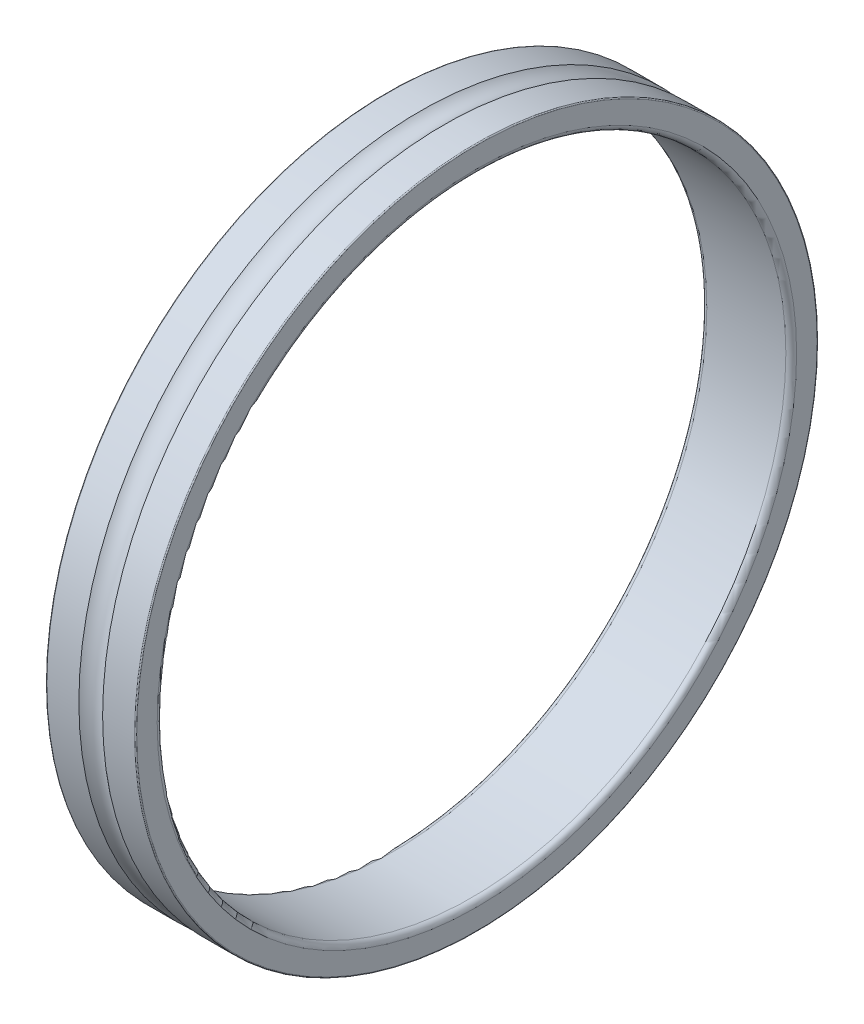
ISO-10303-21;
HEADER;
FILE_DESCRIPTION(('STEP AP214'),'2;1');
FILE_NAME('part.step','',(''),(''),'','','');
FILE_SCHEMA(('AUTOMOTIVE_DESIGN { 1 0 10303 214 1 1 1 1 }'));
ENDSEC;
DATA;
#1=APPLICATION_CONTEXT('core data for automotive mechanical design processes');
#2=APPLICATION_PROTOCOL_DEFINITION('international standard','automotive_design',2000,#1);
#3=PRODUCT_CONTEXT('',#1,'mechanical');
#4=PRODUCT('Part','Part','',(#3));
#5=PRODUCT_RELATED_PRODUCT_CATEGORY('part','',(#4));
#6=PRODUCT_DEFINITION_FORMATION('','',#4);
#7=PRODUCT_DEFINITION_CONTEXT('part definition',#1,'design');
#8=PRODUCT_DEFINITION('design','',#6,#7);
#9=PRODUCT_DEFINITION_SHAPE('','',#8);
#10=(LENGTH_UNIT() NAMED_UNIT(*) SI_UNIT(.MILLI.,.METRE.));
#11=(NAMED_UNIT(*) PLANE_ANGLE_UNIT() SI_UNIT($,.RADIAN.));
#12=(NAMED_UNIT(*) SI_UNIT($,.STERADIAN.) SOLID_ANGLE_UNIT());
#13=UNCERTAINTY_MEASURE_WITH_UNIT(LENGTH_MEASURE(1.E-05),#10,'distance_accuracy_value','');
#14=(GEOMETRIC_REPRESENTATION_CONTEXT(3) GLOBAL_UNCERTAINTY_ASSIGNED_CONTEXT((#13)) GLOBAL_UNIT_ASSIGNED_CONTEXT((#10,
#11,#12)) REPRESENTATION_CONTEXT('',''));
#15=CARTESIAN_POINT('',(0.,0.,0.));
#16=DIRECTION('',(0.,0.,1.));
#17=DIRECTION('',(1.,0.,0.));
#18=AXIS2_PLACEMENT_3D('',#15,#16,#17);
#19=CARTESIAN_POINT('',(0.,-19.2918359504884,-18.94));
#20=DIRECTION('',(-1.,0.,0.));
#21=DIRECTION('',(0.,0.,1.));
#22=AXIS2_PLACEMENT_3D('',#19,#20,#21);
#23=PLANE('',#22);
#24=CARTESIAN_POINT('',(0.,0.,0.));
#25=DIRECTION('',(-1.,0.,0.));
#26=DIRECTION('',(0.,0.,-1.));
#27=AXIS2_PLACEMENT_3D('',#24,#25,#26);
#28=CIRCLE('',#27,18.9400000048967);
#29=CARTESIAN_POINT('',(0.,0.,-18.9400000048967));
#30=VERTEX_POINT('',#29);
#31=EDGE_CURVE('E50',#30,#30,#28,.F.);
#32=ORIENTED_EDGE('',*,*,#31,.F.);
#33=EDGE_LOOP('',(#32));
#34=FACE_BOUND('',#33,.T.);
#35=CARTESIAN_POINT('',(0.,0.,0.));
#36=DIRECTION('',(1.,0.,0.));
#37=DIRECTION('',(0.,0.,1.));
#38=AXIS2_PLACEMENT_3D('',#35,#36,#37);
#39=CIRCLE('',#38,17.8);
#40=CARTESIAN_POINT('',(0.,0.,17.8));
#41=VERTEX_POINT('',#40);
#42=EDGE_CURVE('E47',#41,#41,#39,.T.);
#43=ORIENTED_EDGE('',*,*,#42,.T.);
#44=EDGE_LOOP('',(#43));
#45=FACE_BOUND('',#44,.T.);
#46=ADVANCED_FACE('F15',(#34,#45),#23,.T.);
#47=CARTESIAN_POINT('',(5.,-19.2918359175409,18.94));
#48=DIRECTION('',(1.,0.,0.));
#49=DIRECTION('',(0.,0.,-1.));
#50=AXIS2_PLACEMENT_3D('',#47,#48,#49);
#51=PLANE('',#50);
#52=CARTESIAN_POINT('',(5.,0.,0.));
#53=DIRECTION('',(1.,0.,0.));
#54=DIRECTION('',(0.,-1.16835753790261E-09,1.));
#55=AXIS2_PLACEMENT_3D('',#52,#53,#54);
#56=CIRCLE('',#55,18.94);
#57=CARTESIAN_POINT('',(5.,-2.21286917678754E-08,18.94));
#58=VERTEX_POINT('',#57);
#59=EDGE_CURVE('E44',#58,#58,#56,.T.);
#60=ORIENTED_EDGE('',*,*,#59,.T.);
#61=EDGE_LOOP('',(#60));
#62=FACE_BOUND('',#61,.T.);
#63=CARTESIAN_POINT('',(5.,0.,0.));
#64=DIRECTION('',(-1.,0.,0.));
#65=DIRECTION('',(0.,0.,-1.));
#66=AXIS2_PLACEMENT_3D('',#63,#64,#65);
#67=CIRCLE('',#66,17.8);
#68=CARTESIAN_POINT('',(5.,0.,-17.8));
#69=VERTEX_POINT('',#68);
#70=EDGE_CURVE('E41',#69,#69,#67,.F.);
#71=ORIENTED_EDGE('',*,*,#70,.F.);
#72=EDGE_LOOP('',(#71));
#73=FACE_BOUND('',#72,.T.);
#74=ADVANCED_FACE('F59',(#62,#73),#51,.T.);
#75=CARTESIAN_POINT('',(0.060000000000327,0.,0.));
#76=DIRECTION('',(1.,0.,0.));
#77=DIRECTION('',(0.,1.92337379696791E-10,1.));
#78=AXIS2_PLACEMENT_3D('',#75,#76,#77);
#79=TOROIDAL_SURFACE('',#78,18.9399999999997,0.0600000000003272);
#80=ORIENTED_EDGE('',*,*,#31,.T.);
#81=EDGE_LOOP('',(#80));
#82=FACE_BOUND('',#81,.T.);
#83=CARTESIAN_POINT('',(0.060000000000327,0.,0.));
#84=DIRECTION('',(-1.,0.,0.));
#85=DIRECTION('',(0.,0.,-1.));
#86=AXIS2_PLACEMENT_3D('',#83,#84,#85);
#87=CIRCLE('',#86,19.);
#88=CARTESIAN_POINT('',(0.060000000000327,0.,-19.));
#89=VERTEX_POINT('',#88);
#90=EDGE_CURVE('E38',#89,#89,#87,.F.);
#91=ORIENTED_EDGE('',*,*,#90,.F.);
#92=EDGE_LOOP('',(#91));
#93=FACE_BOUND('',#92,.T.);
#94=ADVANCED_FACE('F54',(#82,#93),#79,.T.);
#95=CARTESIAN_POINT('',(0.29999999999994,0.,0.));
#96=DIRECTION('',(1.,0.,0.));
#97=DIRECTION('',(0.,0.,1.));
#98=AXIS2_PLACEMENT_3D('',#95,#96,#97);
#99=TOROIDAL_SURFACE('',#98,17.8,0.29999999999994);
#100=CARTESIAN_POINT('',(0.3,0.,0.));
#101=DIRECTION('',(1.,0.,0.));
#102=DIRECTION('',(0.,0.,1.));
#103=AXIS2_PLACEMENT_3D('',#100,#101,#102);
#104=CIRCLE('',#103,17.5000000000001);
#105=CARTESIAN_POINT('',(0.3,0.,17.5000000000001));
#106=VERTEX_POINT('',#105);
#107=EDGE_CURVE('E35',#106,#106,#104,.T.);
#108=ORIENTED_EDGE('',*,*,#107,.T.);
#109=EDGE_LOOP('',(#108));
#110=FACE_BOUND('',#109,.T.);
#111=ORIENTED_EDGE('',*,*,#42,.F.);
#112=EDGE_LOOP('',(#111));
#113=FACE_BOUND('',#112,.T.);
#114=ADVANCED_FACE('F63',(#110,#113),#99,.T.);
#115=CARTESIAN_POINT('',(50.,0.,0.));
#116=DIRECTION('',(1.,0.,0.));
#117=DIRECTION('',(0.,0.,1.));
#118=AXIS2_PLACEMENT_3D('',#115,#116,#117);
#119=CYLINDRICAL_SURFACE('',#118,17.5);
#120=CARTESIAN_POINT('',(4.7,0.,0.));
#121=DIRECTION('',(1.,0.,0.));
#122=DIRECTION('',(0.,0.,1.));
#123=AXIS2_PLACEMENT_3D('',#120,#121,#122);
#124=CIRCLE('',#123,17.5);
#125=CARTESIAN_POINT('',(4.7,0.,17.5));
#126=VERTEX_POINT('',#125);
#127=EDGE_CURVE('E30',#126,#126,#124,.T.);
#128=ORIENTED_EDGE('',*,*,#127,.T.);
#129=EDGE_LOOP('',(#128));
#130=FACE_BOUND('',#129,.T.);
#131=ORIENTED_EDGE('',*,*,#107,.F.);
#132=EDGE_LOOP('',(#131));
#133=FACE_BOUND('',#132,.T.);
#134=ADVANCED_FACE('F65',(#130,#133),#119,.F.);
#135=CARTESIAN_POINT('',(4.70000000000012,0.,0.));
#136=DIRECTION('',(1.,0.,0.));
#137=DIRECTION('',(0.,0.,1.));
#138=AXIS2_PLACEMENT_3D('',#135,#136,#137);
#139=TOROIDAL_SURFACE('',#138,17.8,0.299999999999877);
#140=ORIENTED_EDGE('',*,*,#70,.T.);
#141=EDGE_LOOP('',(#140));
#142=FACE_BOUND('',#141,.T.);
#143=ORIENTED_EDGE('',*,*,#127,.F.);
#144=EDGE_LOOP('',(#143));
#145=FACE_BOUND('',#144,.T.);
#146=ADVANCED_FACE('F73',(#142,#145),#139,.T.);
#147=CARTESIAN_POINT('',(4.93999999999968,0.,0.));
#148=DIRECTION('',(1.,0.,0.));
#149=DIRECTION('',(0.,0.,1.));
#150=AXIS2_PLACEMENT_3D('',#147,#148,#149);
#151=TOROIDAL_SURFACE('',#150,18.9399999999997,0.0600000000003167);
#152=CARTESIAN_POINT('',(4.93999999999968,0.,0.));
#153=DIRECTION('',(1.,0.,0.));
#154=DIRECTION('',(0.,0.,1.));
#155=AXIS2_PLACEMENT_3D('',#152,#153,#154);
#156=CIRCLE('',#155,19.);
#157=CARTESIAN_POINT('',(4.93999999999968,0.,19.));
#158=VERTEX_POINT('',#157);
#159=EDGE_CURVE('E26',#158,#158,#156,.T.);
#160=ORIENTED_EDGE('',*,*,#159,.T.);
#161=EDGE_LOOP('',(#160));
#162=FACE_BOUND('',#161,.T.);
#163=ORIENTED_EDGE('',*,*,#59,.F.);
#164=EDGE_LOOP('',(#163));
#165=FACE_BOUND('',#164,.T.);
#166=ADVANCED_FACE('F81',(#162,#165),#151,.T.);
#167=CARTESIAN_POINT('',(50.,0.,0.));
#168=DIRECTION('',(1.,0.,0.));
#169=DIRECTION('',(0.,0.,1.));
#170=AXIS2_PLACEMENT_3D('',#167,#168,#169);
#171=CYLINDRICAL_SURFACE('',#170,19.);
#172=CARTESIAN_POINT('',(3.1614378277661,0.,0.));
#173=DIRECTION('',(1.,0.,0.));
#174=DIRECTION('',(0.,0.,1.));
#175=AXIS2_PLACEMENT_3D('',#172,#173,#174);
#176=CIRCLE('',#175,19.);
#177=CARTESIAN_POINT('',(3.1614378277661,0.,19.));
#178=VERTEX_POINT('',#177);
#179=EDGE_CURVE('E22',#178,#178,#176,.T.);
#180=ORIENTED_EDGE('',*,*,#179,.T.);
#181=EDGE_LOOP('',(#180));
#182=FACE_BOUND('',#181,.T.);
#183=ORIENTED_EDGE('',*,*,#159,.F.);
#184=EDGE_LOOP('',(#183));
#185=FACE_BOUND('',#184,.T.);
#186=ADVANCED_FACE('F85',(#182,#185),#171,.T.);
#187=CARTESIAN_POINT('',(2.5,0.,0.));
#188=DIRECTION('',(1.,0.,0.));
#189=DIRECTION('',(0.,0.,1.));
#190=AXIS2_PLACEMENT_3D('',#187,#188,#189);
#191=TOROIDAL_SURFACE('',#190,19.75,0.999999999999873);
#192=ORIENTED_EDGE('',*,*,#179,.F.);
#193=EDGE_LOOP('',(#192));
#194=FACE_BOUND('',#193,.T.);
#195=CARTESIAN_POINT('',(1.83856217223397,0.,0.));
#196=DIRECTION('',(1.,0.,0.));
#197=DIRECTION('',(0.,0.,1.));
#198=AXIS2_PLACEMENT_3D('',#195,#196,#197);
#199=CIRCLE('',#198,19.0000000000001);
#200=CARTESIAN_POINT('',(1.83856217223397,0.,19.0000000000001));
#201=VERTEX_POINT('',#200);
#202=EDGE_CURVE('E10',#201,#201,#199,.T.);
#203=ORIENTED_EDGE('',*,*,#202,.T.);
#204=EDGE_LOOP('',(#203));
#205=FACE_BOUND('',#204,.T.);
#206=ADVANCED_FACE('F88',(#194,#205),#191,.F.);
#207=CARTESIAN_POINT('',(50.,0.,0.));
#208=DIRECTION('',(1.,0.,0.));
#209=DIRECTION('',(0.,1.92337379696791E-10,1.));
#210=AXIS2_PLACEMENT_3D('',#207,#208,#209);
#211=CYLINDRICAL_SURFACE('',#210,19.);
#212=ORIENTED_EDGE('',*,*,#90,.T.);
#213=EDGE_LOOP('',(#212));
#214=FACE_BOUND('',#213,.T.);
#215=ORIENTED_EDGE('',*,*,#202,.F.);
#216=EDGE_LOOP('',(#215));
#217=FACE_BOUND('',#216,.T.);
#218=ADVANCED_FACE('F17',(#214,#217),#211,.T.);
#219=CLOSED_SHELL('',(#46,#74,#94,#114,#134,#146,#166,#186,#206,#218));
#220=MANIFOLD_SOLID_BREP('B1',#219);
#221=ADVANCED_BREP_SHAPE_REPRESENTATION('',(#18,#220),#14);
#222=SHAPE_DEFINITION_REPRESENTATION(#9,#221);
ENDSEC;
END-ISO-10303-21;
